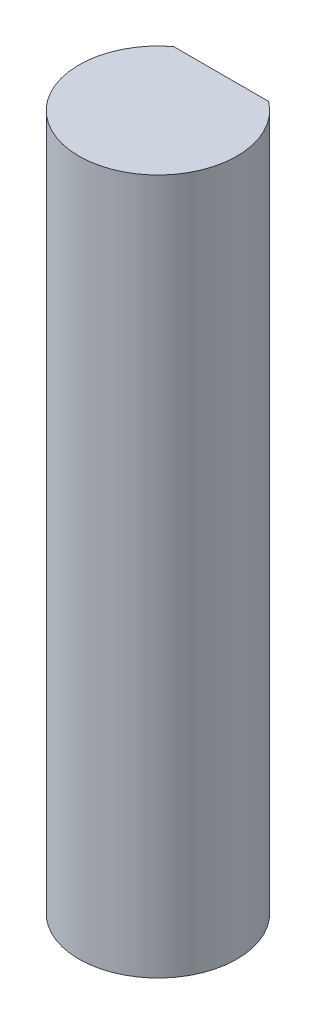
ISO-10303-21;
HEADER;
FILE_DESCRIPTION(('STEP AP214'),'2;1');
FILE_NAME('part.step','',(''),(''),'','','');
FILE_SCHEMA(('AUTOMOTIVE_DESIGN { 1 0 10303 214 1 1 1 1 }'));
ENDSEC;
DATA;
#1=APPLICATION_CONTEXT('core data for automotive mechanical design processes');
#2=APPLICATION_PROTOCOL_DEFINITION('international standard','automotive_design',2000,#1);
#3=PRODUCT_CONTEXT('',#1,'mechanical');
#4=PRODUCT('Part','Part','',(#3));
#5=PRODUCT_RELATED_PRODUCT_CATEGORY('part','',(#4));
#6=PRODUCT_DEFINITION_FORMATION('','',#4);
#7=PRODUCT_DEFINITION_CONTEXT('part definition',#1,'design');
#8=PRODUCT_DEFINITION('design','',#6,#7);
#9=PRODUCT_DEFINITION_SHAPE('','',#8);
#10=(LENGTH_UNIT() NAMED_UNIT(*) SI_UNIT(.MILLI.,.METRE.));
#11=(NAMED_UNIT(*) PLANE_ANGLE_UNIT() SI_UNIT($,.RADIAN.));
#12=(NAMED_UNIT(*) SI_UNIT($,.STERADIAN.) SOLID_ANGLE_UNIT());
#13=UNCERTAINTY_MEASURE_WITH_UNIT(LENGTH_MEASURE(1.E-05),#10,'distance_accuracy_value','');
#14=(GEOMETRIC_REPRESENTATION_CONTEXT(3) GLOBAL_UNCERTAINTY_ASSIGNED_CONTEXT((#13)) GLOBAL_UNIT_ASSIGNED_CONTEXT((#10,
#11,#12)) REPRESENTATION_CONTEXT('',''));
#15=CARTESIAN_POINT('',(0.,0.,0.));
#16=DIRECTION('',(0.,0.,1.));
#17=DIRECTION('',(1.,0.,0.));
#18=AXIS2_PLACEMENT_3D('',#15,#16,#17);
#19=CARTESIAN_POINT('',(0.,22.,0.));
#20=DIRECTION('',(0.,-1.,0.));
#21=DIRECTION('',(0.,0.,-1.));
#22=AXIS2_PLACEMENT_3D('',#19,#20,#21);
#23=CYLINDRICAL_SURFACE('',#22,2.5);
#24=CARTESIAN_POINT('',(0.,7.,0.));
#25=DIRECTION('',(0.,1.,0.));
#26=DIRECTION('',(0.,0.,1.));
#27=AXIS2_PLACEMENT_3D('',#24,#25,#26);
#28=CIRCLE('',#27,2.5);
#29=CARTESIAN_POINT('',(1.5,7.,-2.));
#30=VERTEX_POINT('',#29);
#31=CARTESIAN_POINT('',(-1.5,7.,-2.));
#32=VERTEX_POINT('',#31);
#33=EDGE_CURVE('E62',#30,#32,#28,.T.);
#34=ORIENTED_EDGE('',*,*,#33,.F.);
#35=DIRECTION('',(0.,1.,0.));
#36=VECTOR('',#35,1.);
#37=CARTESIAN_POINT('',(1.5,7.,-2.));
#38=LINE('',#37,#36);
#39=CARTESIAN_POINT('',(1.5,22.,-2.));
#40=VERTEX_POINT('',#39);
#41=EDGE_CURVE('E80',#30,#40,#38,.T.);
#42=ORIENTED_EDGE('',*,*,#41,.T.);
#43=CARTESIAN_POINT('',(0.,22.,0.));
#44=DIRECTION('',(0.,1.,0.));
#45=DIRECTION('',(0.,0.,1.));
#46=AXIS2_PLACEMENT_3D('',#43,#44,#45);
#47=CIRCLE('',#46,2.5);
#48=CARTESIAN_POINT('',(-1.5,22.,-2.));
#49=VERTEX_POINT('',#48);
#50=EDGE_CURVE('E11',#49,#40,#47,.T.);
#51=ORIENTED_EDGE('',*,*,#50,.F.);
#52=DIRECTION('',(0.,1.,0.));
#53=VECTOR('',#52,1.);
#54=CARTESIAN_POINT('',(-1.5,7.,-2.));
#55=LINE('',#54,#53);
#56=EDGE_CURVE('E73',#32,#49,#55,.T.);
#57=ORIENTED_EDGE('',*,*,#56,.F.);
#58=EDGE_LOOP('',(#34,#42,#51,#57));
#59=FACE_BOUND('',#58,.T.);
#60=CARTESIAN_POINT('',(0.,0.,0.));
#61=DIRECTION('',(0.,1.,0.));
#62=DIRECTION('',(0.,0.,1.));
#63=AXIS2_PLACEMENT_3D('',#60,#61,#62);
#64=CIRCLE('',#63,2.5);
#65=CARTESIAN_POINT('',(0.,0.,2.5));
#66=VERTEX_POINT('',#65);
#67=EDGE_CURVE('E48',#66,#66,#64,.T.);
#68=ORIENTED_EDGE('',*,*,#67,.T.);
#69=EDGE_LOOP('',(#68));
#70=FACE_BOUND('',#69,.T.);
#71=ADVANCED_FACE('F44',(#59,#70),#23,.T.);
#72=CARTESIAN_POINT('',(0.,22.,0.));
#73=DIRECTION('',(0.,1.,0.));
#74=DIRECTION('',(0.,0.,1.));
#75=AXIS2_PLACEMENT_3D('',#72,#73,#74);
#76=PLANE('',#75);
#77=DIRECTION('',(1.,0.,0.));
#78=VECTOR('',#77,1.);
#79=CARTESIAN_POINT('',(0.,22.,-2.));
#80=LINE('',#79,#78);
#81=EDGE_CURVE('E72',#49,#40,#80,.T.);
#82=ORIENTED_EDGE('',*,*,#81,.F.);
#83=ORIENTED_EDGE('',*,*,#50,.T.);
#84=EDGE_LOOP('',(#82,#83));
#85=FACE_BOUND('',#84,.T.);
#86=ADVANCED_FACE('F85',(#85),#76,.T.);
#87=CARTESIAN_POINT('',(0.,0.,0.));
#88=DIRECTION('',(0.,1.,0.));
#89=DIRECTION('',(0.,0.,1.));
#90=AXIS2_PLACEMENT_3D('',#87,#88,#89);
#91=PLANE('',#90);
#92=ORIENTED_EDGE('',*,*,#67,.F.);
#93=EDGE_LOOP('',(#92));
#94=FACE_BOUND('',#93,.T.);
#95=ADVANCED_FACE('F96',(#94),#91,.F.);
#96=CARTESIAN_POINT('',(0.,7.,-2.));
#97=DIRECTION('',(0.,0.,1.));
#98=DIRECTION('',(1.,0.,0.));
#99=AXIS2_PLACEMENT_3D('',#96,#97,#98);
#100=PLANE('',#99);
#101=ORIENTED_EDGE('',*,*,#81,.T.);
#102=ORIENTED_EDGE('',*,*,#41,.F.);
#103=DIRECTION('',(1.,0.,0.));
#104=VECTOR('',#103,1.);
#105=CARTESIAN_POINT('',(0.,7.,-2.));
#106=LINE('',#105,#104);
#107=EDGE_CURVE('E56',#32,#30,#106,.T.);
#108=ORIENTED_EDGE('',*,*,#107,.F.);
#109=ORIENTED_EDGE('',*,*,#56,.T.);
#110=EDGE_LOOP('',(#101,#102,#108,#109));
#111=FACE_BOUND('',#110,.T.);
#112=ADVANCED_FACE('F71',(#111),#100,.F.);
#113=CARTESIAN_POINT('',(0.,7.,0.));
#114=DIRECTION('',(0.,1.,0.));
#115=DIRECTION('',(0.,0.,1.));
#116=AXIS2_PLACEMENT_3D('',#113,#114,#115);
#117=PLANE('',#116);
#118=ORIENTED_EDGE('',*,*,#33,.T.);
#119=ORIENTED_EDGE('',*,*,#107,.T.);
#120=EDGE_LOOP('',(#118,#119));
#121=FACE_BOUND('',#120,.T.);
#122=ADVANCED_FACE('F105',(#121),#117,.T.);
#123=CLOSED_SHELL('',(#71,#86,#95,#112,#122));
#124=MANIFOLD_SOLID_BREP('B2',#123);
#125=ADVANCED_BREP_SHAPE_REPRESENTATION('',(#18,#124),#14);
#126=SHAPE_DEFINITION_REPRESENTATION(#9,#125);
ENDSEC;
END-ISO-10303-21;
